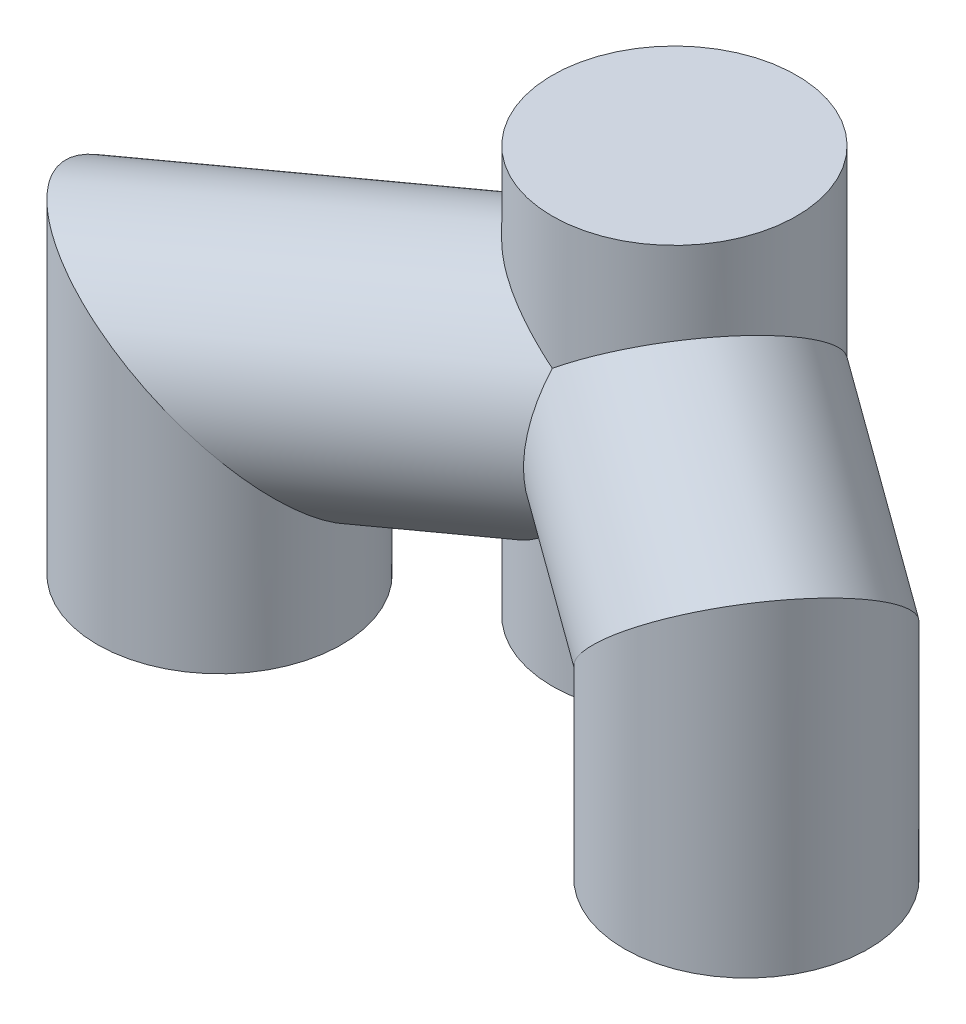
ISO-10303-21;
HEADER;
FILE_DESCRIPTION(('STEP AP214'),'2;1');
FILE_NAME('part.step','',(''),(''),'','','');
FILE_SCHEMA(('AUTOMOTIVE_DESIGN { 1 0 10303 214 1 1 1 1 }'));
ENDSEC;
DATA;
#1=APPLICATION_CONTEXT('core data for automotive mechanical design processes');
#2=APPLICATION_PROTOCOL_DEFINITION('international standard','automotive_design',2000,#1);
#3=PRODUCT_CONTEXT('',#1,'mechanical');
#4=PRODUCT('Part','Part','',(#3));
#5=PRODUCT_RELATED_PRODUCT_CATEGORY('part','',(#4));
#6=PRODUCT_DEFINITION_FORMATION('','',#4);
#7=PRODUCT_DEFINITION_CONTEXT('part definition',#1,'design');
#8=PRODUCT_DEFINITION('design','',#6,#7);
#9=PRODUCT_DEFINITION_SHAPE('','',#8);
#10=(LENGTH_UNIT() NAMED_UNIT(*) SI_UNIT(.MILLI.,.METRE.));
#11=(NAMED_UNIT(*) PLANE_ANGLE_UNIT() SI_UNIT($,.RADIAN.));
#12=(NAMED_UNIT(*) SI_UNIT($,.STERADIAN.) SOLID_ANGLE_UNIT());
#13=UNCERTAINTY_MEASURE_WITH_UNIT(LENGTH_MEASURE(1.E-05),#10,'distance_accuracy_value','');
#14=(GEOMETRIC_REPRESENTATION_CONTEXT(3) GLOBAL_UNCERTAINTY_ASSIGNED_CONTEXT((#13)) GLOBAL_UNIT_ASSIGNED_CONTEXT((#10,
#11,#12)) REPRESENTATION_CONTEXT('',''));
#15=CARTESIAN_POINT('',(0.,0.,0.));
#16=DIRECTION('',(0.,0.,1.));
#17=DIRECTION('',(1.,0.,0.));
#18=AXIS2_PLACEMENT_3D('',#15,#16,#17);
#19=CARTESIAN_POINT('',(-6.26146934359944,2.5,4.54922376592683));
#20=DIRECTION('',(0.809016994374946,0.,-0.587785252292475));
#21=DIRECTION('',(-0.587785252292475,0.,-0.809016994374946));
#22=AXIS2_PLACEMENT_3D('',#19,#20,#21);
#23=CYLINDRICAL_SURFACE('',#22,1.5);
#24=CARTESIAN_POINT('',(-3.23606797749979,2.5,2.3511410091699));
#25=DIRECTION('',(0.572061402817683,0.707106781186547,-0.415626937777455));
#26=DIRECTION('',(-0.572061402817683,0.707106781186548,0.415626937777455));
#27=AXIS2_PLACEMENT_3D('',#24,#25,#26);
#28=ELLIPSE('',#27,2.12132034355964,1.5);
#29=CARTESIAN_POINT('',(-4.44959346906221,4.,3.23281888760861));
#30=VERTEX_POINT('',#29);
#31=EDGE_CURVE('E74',#30,#30,#28,.F.);
#32=ORIENTED_EDGE('',*,*,#31,.F.);
#33=EDGE_LOOP('',(#32));
#34=FACE_BOUND('',#33,.T.);
#35=CARTESIAN_POINT('',(0.,2.5,0.));
#36=DIRECTION('',(0.572061402817683,0.707106781186547,-0.415626937777455));
#37=DIRECTION('',(0.572061402817683,-0.707106781186547,-0.415626937777455));
#38=AXIS2_PLACEMENT_3D('',#35,#36,#37);
#39=ELLIPSE('',#38,2.12132034355964,1.5);
#40=CARTESIAN_POINT('',(0.,3.38167787843871,1.5));
#41=VERTEX_POINT('',#40);
#42=CARTESIAN_POINT('',(-0.881677878438712,2.5,-1.21352549156242));
#43=VERTEX_POINT('',#42);
#44=EDGE_CURVE('E55',#41,#43,#39,.F.);
#45=ORIENTED_EDGE('',*,*,#44,.T.);
#46=CARTESIAN_POINT('',(0.,2.5,0.));
#47=DIRECTION('',(0.572061402817683,-0.707106781186547,-0.415626937777455));
#48=DIRECTION('',(0.572061402817683,0.707106781186547,-0.415626937777455));
#49=AXIS2_PLACEMENT_3D('',#46,#47,#48);
#50=ELLIPSE('',#49,2.12132034355964,1.5);
#51=CARTESIAN_POINT('',(0.,1.61832212156129,1.5));
#52=VERTEX_POINT('',#51);
#53=EDGE_CURVE('E60',#43,#52,#50,.F.);
#54=ORIENTED_EDGE('',*,*,#53,.T.);
#55=CARTESIAN_POINT('',(0.,2.5,0.));
#56=DIRECTION('',(1.,0.,0.));
#57=DIRECTION('',(0.,0.,-1.));
#58=AXIS2_PLACEMENT_3D('',#55,#56,#57);
#59=ELLIPSE('',#58,1.85410196624968,1.5);
#60=EDGE_CURVE('E70',#41,#52,#59,.T.);
#61=ORIENTED_EDGE('',*,*,#60,.F.);
#62=EDGE_LOOP('',(#45,#54,#61));
#63=FACE_BOUND('',#62,.T.);
#64=ADVANCED_FACE('F39',(#34,#63),#23,.T.);
#65=CARTESIAN_POINT('',(6.26146934359948,2.5,4.54922376592678));
#66=DIRECTION('',(-0.809016994374951,0.,-0.587785252292468));
#67=DIRECTION('',(-0.587785252292469,0.,0.809016994374951));
#68=AXIS2_PLACEMENT_3D('',#65,#66,#67);
#69=CYLINDRICAL_SURFACE('',#68,1.5);
#70=CARTESIAN_POINT('',(3.2360679774998,2.5,2.35114100916987));
#71=DIRECTION('',(-0.572061402817687,0.707106781186547,-0.41562693777745));
#72=DIRECTION('',(0.572061402817687,0.707106781186547,0.41562693777745));
#73=AXIS2_PLACEMENT_3D('',#70,#71,#72);
#74=ELLIPSE('',#73,2.12132034355964,1.5);
#75=CARTESIAN_POINT('',(4.44959346906223,4.,3.23281888760858));
#76=VERTEX_POINT('',#75);
#77=EDGE_CURVE('E84',#76,#76,#74,.F.);
#78=ORIENTED_EDGE('',*,*,#77,.F.);
#79=EDGE_LOOP('',(#78));
#80=FACE_BOUND('',#79,.T.);
#81=ORIENTED_EDGE('',*,*,#60,.T.);
#82=CARTESIAN_POINT('',(0.,2.5,0.));
#83=DIRECTION('',(-0.572061402817687,-0.707106781186548,-0.41562693777745));
#84=DIRECTION('',(-0.572061402817687,0.707106781186547,-0.41562693777745));
#85=AXIS2_PLACEMENT_3D('',#82,#83,#84);
#86=ELLIPSE('',#85,2.12132034355964,1.5);
#87=CARTESIAN_POINT('',(0.881677878438703,2.5,-1.21352549156243));
#88=VERTEX_POINT('',#87);
#89=EDGE_CURVE('E11',#52,#88,#86,.F.);
#90=ORIENTED_EDGE('',*,*,#89,.T.);
#91=CARTESIAN_POINT('',(0.,2.5,0.));
#92=DIRECTION('',(-0.572061402817687,0.707106781186547,-0.41562693777745));
#93=DIRECTION('',(-0.572061402817687,-0.707106781186548,-0.41562693777745));
#94=AXIS2_PLACEMENT_3D('',#91,#92,#93);
#95=ELLIPSE('',#94,2.12132034355964,1.5);
#96=EDGE_CURVE('E48',#88,#41,#95,.F.);
#97=ORIENTED_EDGE('',*,*,#96,.T.);
#98=EDGE_LOOP('',(#81,#90,#97));
#99=FACE_BOUND('',#98,.T.);
#100=ADVANCED_FACE('F71',(#80,#99),#69,.T.);
#101=CARTESIAN_POINT('',(-3.23606797749979,0.,2.3511410091699));
#102=DIRECTION('',(0.,1.,0.));
#103=DIRECTION('',(0.,0.,1.));
#104=AXIS2_PLACEMENT_3D('',#101,#102,#103);
#105=PLANE('',#104);
#106=CARTESIAN_POINT('',(-3.23606797749979,0.,2.3511410091699));
#107=DIRECTION('',(0.,1.,0.));
#108=DIRECTION('',(0.,0.,1.));
#109=AXIS2_PLACEMENT_3D('',#106,#107,#108);
#110=CIRCLE('',#109,1.5);
#111=CARTESIAN_POINT('',(-3.23606797749979,0.,3.8511410091699));
#112=VERTEX_POINT('',#111);
#113=EDGE_CURVE('E78',#112,#112,#110,.T.);
#114=ORIENTED_EDGE('',*,*,#113,.F.);
#115=EDGE_LOOP('',(#114));
#116=FACE_BOUND('',#115,.T.);
#117=ADVANCED_FACE('F41',(#116),#105,.F.);
#118=CARTESIAN_POINT('',(-3.23606797749979,0.,2.3511410091699));
#119=DIRECTION('',(0.,1.,0.));
#120=DIRECTION('',(0.,0.,1.));
#121=AXIS2_PLACEMENT_3D('',#118,#119,#120);
#122=CYLINDRICAL_SURFACE('',#121,1.5);
#123=ORIENTED_EDGE('',*,*,#113,.T.);
#124=EDGE_LOOP('',(#123));
#125=FACE_BOUND('',#124,.T.);
#126=ORIENTED_EDGE('',*,*,#31,.T.);
#127=EDGE_LOOP('',(#126));
#128=FACE_BOUND('',#127,.T.);
#129=ADVANCED_FACE('F127',(#125,#128),#122,.T.);
#130=CARTESIAN_POINT('',(3.2360679774998,0.,2.35114100916987));
#131=DIRECTION('',(0.,1.,0.));
#132=DIRECTION('',(0.,0.,1.));
#133=AXIS2_PLACEMENT_3D('',#130,#131,#132);
#134=PLANE('',#133);
#135=CARTESIAN_POINT('',(3.2360679774998,0.,2.35114100916987));
#136=DIRECTION('',(0.,1.,0.));
#137=DIRECTION('',(0.,0.,1.));
#138=AXIS2_PLACEMENT_3D('',#135,#136,#137);
#139=CIRCLE('',#138,1.5);
#140=CARTESIAN_POINT('',(3.2360679774998,0.,3.85114100916987));
#141=VERTEX_POINT('',#140);
#142=EDGE_CURVE('E88',#141,#141,#139,.T.);
#143=ORIENTED_EDGE('',*,*,#142,.F.);
#144=EDGE_LOOP('',(#143));
#145=FACE_BOUND('',#144,.T.);
#146=ADVANCED_FACE('F110',(#145),#134,.F.);
#147=CARTESIAN_POINT('',(3.2360679774998,0.,2.35114100916987));
#148=DIRECTION('',(0.,1.,0.));
#149=DIRECTION('',(0.,0.,1.));
#150=AXIS2_PLACEMENT_3D('',#147,#148,#149);
#151=CYLINDRICAL_SURFACE('',#150,1.5);
#152=ORIENTED_EDGE('',*,*,#142,.T.);
#153=EDGE_LOOP('',(#152));
#154=FACE_BOUND('',#153,.T.);
#155=ORIENTED_EDGE('',*,*,#77,.T.);
#156=EDGE_LOOP('',(#155));
#157=FACE_BOUND('',#156,.T.);
#158=ADVANCED_FACE('F108',(#154,#157),#151,.T.);
#159=CARTESIAN_POINT('',(0.,5.,0.));
#160=DIRECTION('',(0.,-1.,0.));
#161=DIRECTION('',(0.,0.,-1.));
#162=AXIS2_PLACEMENT_3D('',#159,#160,#161);
#163=CYLINDRICAL_SURFACE('',#162,1.5);
#164=ORIENTED_EDGE('',*,*,#53,.F.);
#165=ORIENTED_EDGE('',*,*,#44,.F.);
#166=ORIENTED_EDGE('',*,*,#96,.F.);
#167=ORIENTED_EDGE('',*,*,#89,.F.);
#168=EDGE_LOOP('',(#164,#165,#166,#167));
#169=FACE_BOUND('',#168,.T.);
#170=CARTESIAN_POINT('',(0.,5.,0.));
#171=DIRECTION('',(0.,1.,0.));
#172=DIRECTION('',(0.,0.,1.));
#173=AXIS2_PLACEMENT_3D('',#170,#171,#172);
#174=CIRCLE('',#173,1.5);
#175=CARTESIAN_POINT('',(0.,5.,1.5));
#176=VERTEX_POINT('',#175);
#177=EDGE_CURVE('E96',#176,#176,#174,.T.);
#178=ORIENTED_EDGE('',*,*,#177,.F.);
#179=EDGE_LOOP('',(#178));
#180=FACE_BOUND('',#179,.T.);
#181=CARTESIAN_POINT('',(0.,0.,0.));
#182=DIRECTION('',(0.,1.,0.));
#183=DIRECTION('',(0.,0.,1.));
#184=AXIS2_PLACEMENT_3D('',#181,#182,#183);
#185=CIRCLE('',#184,1.5);
#186=CARTESIAN_POINT('',(0.,0.,1.5));
#187=VERTEX_POINT('',#186);
#188=EDGE_CURVE('E97',#187,#187,#185,.T.);
#189=ORIENTED_EDGE('',*,*,#188,.T.);
#190=EDGE_LOOP('',(#189));
#191=FACE_BOUND('',#190,.T.);
#192=ADVANCED_FACE('F64',(#169,#180,#191),#163,.T.);
#193=CARTESIAN_POINT('',(0.,5.,0.));
#194=DIRECTION('',(0.,1.,0.));
#195=DIRECTION('',(0.,0.,1.));
#196=AXIS2_PLACEMENT_3D('',#193,#194,#195);
#197=PLANE('',#196);
#198=ORIENTED_EDGE('',*,*,#177,.T.);
#199=EDGE_LOOP('',(#198));
#200=FACE_BOUND('',#199,.T.);
#201=ADVANCED_FACE('F105',(#200),#197,.T.);
#202=CARTESIAN_POINT('',(0.,0.,0.));
#203=DIRECTION('',(0.,1.,0.));
#204=DIRECTION('',(0.,0.,1.));
#205=AXIS2_PLACEMENT_3D('',#202,#203,#204);
#206=PLANE('',#205);
#207=ORIENTED_EDGE('',*,*,#188,.F.);
#208=EDGE_LOOP('',(#207));
#209=FACE_BOUND('',#208,.T.);
#210=ADVANCED_FACE('F113',(#209),#206,.F.);
#211=CLOSED_SHELL('',(#64,#100,#117,#129,#146,#158,#192,#201,#210));
#212=MANIFOLD_SOLID_BREP('B2',#211);
#213=ADVANCED_BREP_SHAPE_REPRESENTATION('',(#18,#212),#14);
#214=SHAPE_DEFINITION_REPRESENTATION(#9,#213);
ENDSEC;
END-ISO-10303-21;
